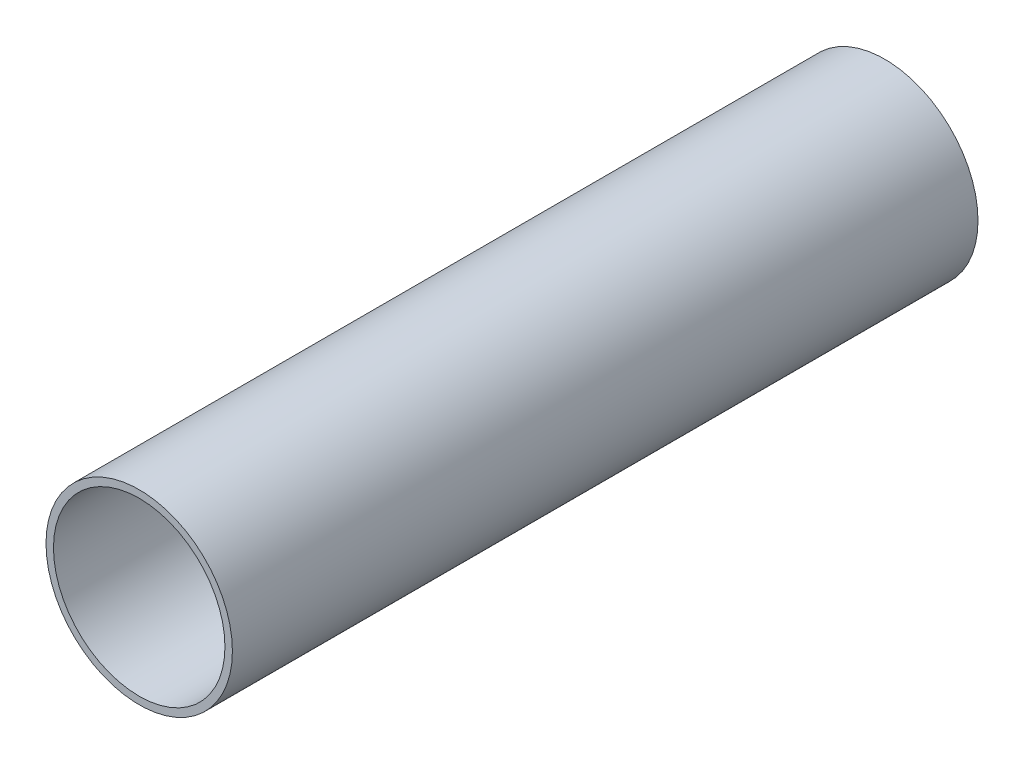
ISO-10303-21;
HEADER;
FILE_DESCRIPTION(('STEP AP214'),'2;1');
FILE_NAME('part.step','',(''),(''),'','','');
FILE_SCHEMA(('AUTOMOTIVE_DESIGN { 1 0 10303 214 1 1 1 1 }'));
ENDSEC;
DATA;
#1=APPLICATION_CONTEXT('core data for automotive mechanical design processes');
#2=APPLICATION_PROTOCOL_DEFINITION('international standard','automotive_design',2000,#1);
#3=PRODUCT_CONTEXT('',#1,'mechanical');
#4=PRODUCT('Part','Part','',(#3));
#5=PRODUCT_RELATED_PRODUCT_CATEGORY('part','',(#4));
#6=PRODUCT_DEFINITION_FORMATION('','',#4);
#7=PRODUCT_DEFINITION_CONTEXT('part definition',#1,'design');
#8=PRODUCT_DEFINITION('design','',#6,#7);
#9=PRODUCT_DEFINITION_SHAPE('','',#8);
#10=(LENGTH_UNIT() NAMED_UNIT(*) SI_UNIT(.MILLI.,.METRE.));
#11=(NAMED_UNIT(*) PLANE_ANGLE_UNIT() SI_UNIT($,.RADIAN.));
#12=(NAMED_UNIT(*) SI_UNIT($,.STERADIAN.) SOLID_ANGLE_UNIT());
#13=UNCERTAINTY_MEASURE_WITH_UNIT(LENGTH_MEASURE(1.E-05),#10,'distance_accuracy_value','');
#14=(GEOMETRIC_REPRESENTATION_CONTEXT(3) GLOBAL_UNCERTAINTY_ASSIGNED_CONTEXT((#13)) GLOBAL_UNIT_ASSIGNED_CONTEXT((#10,
#11,#12)) REPRESENTATION_CONTEXT('',''));
#15=CARTESIAN_POINT('',(0.,0.,0.));
#16=DIRECTION('',(0.,0.,1.));
#17=DIRECTION('',(1.,0.,0.));
#18=AXIS2_PLACEMENT_3D('',#15,#16,#17);
#19=CARTESIAN_POINT('',(0.,0.,100.));
#20=DIRECTION('',(0.,0.,1.));
#21=DIRECTION('',(1.,0.,0.));
#22=AXIS2_PLACEMENT_3D('',#19,#20,#21);
#23=PLANE('',#22);
#24=CARTESIAN_POINT('',(0.,0.,100.));
#25=DIRECTION('',(0.,0.,1.));
#26=DIRECTION('',(1.,0.,0.));
#27=AXIS2_PLACEMENT_3D('',#24,#25,#26);
#28=CIRCLE('',#27,12.5);
#29=CARTESIAN_POINT('',(12.5,0.,100.));
#30=VERTEX_POINT('',#29);
#31=EDGE_CURVE('E10',#30,#30,#28,.T.);
#32=ORIENTED_EDGE('',*,*,#31,.T.);
#33=EDGE_LOOP('',(#32));
#34=FACE_BOUND('',#33,.T.);
#35=CARTESIAN_POINT('',(0.,0.,100.));
#36=DIRECTION('',(0.,0.,1.));
#37=DIRECTION('',(1.,0.,0.));
#38=AXIS2_PLACEMENT_3D('',#35,#36,#37);
#39=CIRCLE('',#38,11.5);
#40=CARTESIAN_POINT('',(11.5,0.,100.));
#41=VERTEX_POINT('',#40);
#42=EDGE_CURVE('E42',#41,#41,#39,.T.);
#43=ORIENTED_EDGE('',*,*,#42,.F.);
#44=EDGE_LOOP('',(#43));
#45=FACE_BOUND('',#44,.T.);
#46=ADVANCED_FACE('F31',(#34,#45),#23,.T.);
#47=CARTESIAN_POINT('',(0.,0.,0.));
#48=DIRECTION('',(0.,0.,1.));
#49=DIRECTION('',(1.,0.,0.));
#50=AXIS2_PLACEMENT_3D('',#47,#48,#49);
#51=PLANE('',#50);
#52=CARTESIAN_POINT('',(0.,0.,0.));
#53=DIRECTION('',(0.,0.,1.));
#54=DIRECTION('',(1.,0.,0.));
#55=AXIS2_PLACEMENT_3D('',#52,#53,#54);
#56=CIRCLE('',#55,12.5);
#57=CARTESIAN_POINT('',(12.5,0.,0.));
#58=VERTEX_POINT('',#57);
#59=EDGE_CURVE('E35',#58,#58,#56,.T.);
#60=ORIENTED_EDGE('',*,*,#59,.F.);
#61=EDGE_LOOP('',(#60));
#62=FACE_BOUND('',#61,.T.);
#63=CARTESIAN_POINT('',(0.,0.,0.));
#64=DIRECTION('',(0.,0.,1.));
#65=DIRECTION('',(1.,0.,0.));
#66=AXIS2_PLACEMENT_3D('',#63,#64,#65);
#67=CIRCLE('',#66,11.5);
#68=CARTESIAN_POINT('',(11.5,0.,0.));
#69=VERTEX_POINT('',#68);
#70=EDGE_CURVE('E44',#69,#69,#67,.T.);
#71=ORIENTED_EDGE('',*,*,#70,.T.);
#72=EDGE_LOOP('',(#71));
#73=FACE_BOUND('',#72,.T.);
#74=ADVANCED_FACE('F54',(#62,#73),#51,.F.);
#75=CARTESIAN_POINT('',(0.,0.,100.));
#76=DIRECTION('',(0.,0.,-1.));
#77=DIRECTION('',(-1.,0.,0.));
#78=AXIS2_PLACEMENT_3D('',#75,#76,#77);
#79=CYLINDRICAL_SURFACE('',#78,12.5);
#80=ORIENTED_EDGE('',*,*,#31,.F.);
#81=EDGE_LOOP('',(#80));
#82=FACE_BOUND('',#81,.T.);
#83=ORIENTED_EDGE('',*,*,#59,.T.);
#84=EDGE_LOOP('',(#83));
#85=FACE_BOUND('',#84,.T.);
#86=ADVANCED_FACE('F33',(#82,#85),#79,.T.);
#87=CARTESIAN_POINT('',(0.,0.,100.));
#88=DIRECTION('',(0.,0.,-1.));
#89=DIRECTION('',(-1.,0.,0.));
#90=AXIS2_PLACEMENT_3D('',#87,#88,#89);
#91=CYLINDRICAL_SURFACE('',#90,11.5);
#92=ORIENTED_EDGE('',*,*,#42,.T.);
#93=EDGE_LOOP('',(#92));
#94=FACE_BOUND('',#93,.T.);
#95=ORIENTED_EDGE('',*,*,#70,.F.);
#96=EDGE_LOOP('',(#95));
#97=FACE_BOUND('',#96,.T.);
#98=ADVANCED_FACE('F50',(#94,#97),#91,.F.);
#99=CLOSED_SHELL('',(#46,#74,#86,#98));
#100=MANIFOLD_SOLID_BREP('B2',#99);
#101=ADVANCED_BREP_SHAPE_REPRESENTATION('',(#18,#100),#14);
#102=SHAPE_DEFINITION_REPRESENTATION(#9,#101);
ENDSEC;
END-ISO-10303-21;
